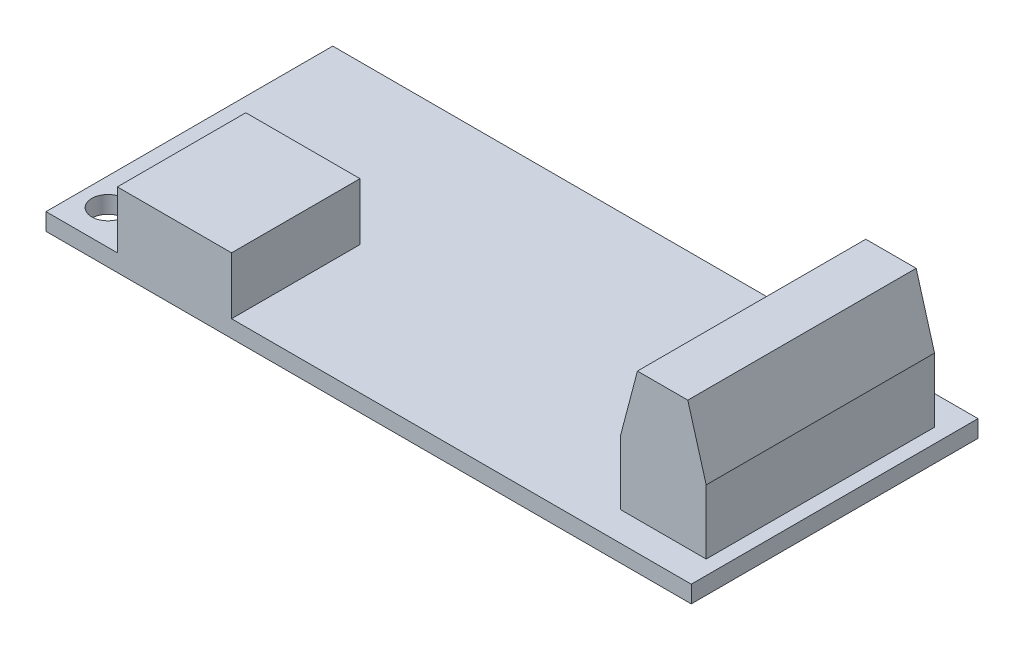
ISO-10303-21;
HEADER;
FILE_DESCRIPTION(('STEP AP214'),'2;1');
FILE_NAME('part.step','',(''),(''),'','','');
FILE_SCHEMA(('AUTOMOTIVE_DESIGN { 1 0 10303 214 1 1 1 1 }'));
ENDSEC;
DATA;
#1=APPLICATION_CONTEXT('core data for automotive mechanical design processes');
#2=APPLICATION_PROTOCOL_DEFINITION('international standard','automotive_design',2000,#1);
#3=PRODUCT_CONTEXT('',#1,'mechanical');
#4=PRODUCT('Part','Part','',(#3));
#5=PRODUCT_RELATED_PRODUCT_CATEGORY('part','',(#4));
#6=PRODUCT_DEFINITION_FORMATION('','',#4);
#7=PRODUCT_DEFINITION_CONTEXT('part definition',#1,'design');
#8=PRODUCT_DEFINITION('design','',#6,#7);
#9=PRODUCT_DEFINITION_SHAPE('','',#8);
#10=(LENGTH_UNIT() NAMED_UNIT(*) SI_UNIT(.MILLI.,.METRE.));
#11=(NAMED_UNIT(*) PLANE_ANGLE_UNIT() SI_UNIT($,.RADIAN.));
#12=(NAMED_UNIT(*) SI_UNIT($,.STERADIAN.) SOLID_ANGLE_UNIT());
#13=UNCERTAINTY_MEASURE_WITH_UNIT(LENGTH_MEASURE(1.E-05),#10,'distance_accuracy_value','');
#14=(GEOMETRIC_REPRESENTATION_CONTEXT(3) GLOBAL_UNCERTAINTY_ASSIGNED_CONTEXT((#13)) GLOBAL_UNIT_ASSIGNED_CONTEXT((#10,
#11,#12)) REPRESENTATION_CONTEXT('',''));
#15=CARTESIAN_POINT('',(0.,0.,0.));
#16=DIRECTION('',(0.,0.,1.));
#17=DIRECTION('',(1.,0.,0.));
#18=AXIS2_PLACEMENT_3D('',#15,#16,#17);
#19=CARTESIAN_POINT('',(0.,1.2,0.));
#20=DIRECTION('',(0.,1.,0.));
#21=DIRECTION('',(0.,0.,1.));
#22=AXIS2_PLACEMENT_3D('',#19,#20,#21);
#23=PLANE('',#22);
#24=CARTESIAN_POINT('',(11.835,1.2,-7.785));
#25=DIRECTION('',(0.,1.,0.));
#26=DIRECTION('',(0.,0.,1.));
#27=AXIS2_PLACEMENT_3D('',#24,#25,#26);
#28=CIRCLE('',#27,1.13);
#29=CARTESIAN_POINT('',(11.835,1.2,-6.655));
#30=VERTEX_POINT('',#29);
#31=EDGE_CURVE('E211',#30,#30,#28,.T.);
#32=ORIENTED_EDGE('',*,*,#31,.F.);
#33=EDGE_LOOP('',(#32));
#34=FACE_BOUND('',#33,.T.);
#35=CARTESIAN_POINT('',(-20.675,1.2,7.635));
#36=DIRECTION('',(0.,1.,0.));
#37=DIRECTION('',(0.,0.,1.));
#38=AXIS2_PLACEMENT_3D('',#35,#36,#37);
#39=CIRCLE('',#38,1.13);
#40=CARTESIAN_POINT('',(-20.675,1.2,8.765));
#41=VERTEX_POINT('',#40);
#42=EDGE_CURVE('E205',#41,#41,#39,.T.);
#43=ORIENTED_EDGE('',*,*,#42,.F.);
#44=EDGE_LOOP('',(#43));
#45=FACE_BOUND('',#44,.T.);
#46=DIRECTION('',(1.,0.,0.));
#47=VECTOR('',#46,1.);
#48=CARTESIAN_POINT('',(15.605,1.2,8.));
#49=LINE('',#48,#47);
#50=CARTESIAN_POINT('',(15.605,1.2,8.));
#51=VERTEX_POINT('',#50);
#52=CARTESIAN_POINT('',(21.605,1.2,8.));
#53=VERTEX_POINT('',#52);
#54=EDGE_CURVE('E189',#51,#53,#49,.T.);
#55=ORIENTED_EDGE('',*,*,#54,.F.);
#56=DIRECTION('',(0.,0.,1.));
#57=VECTOR('',#56,1.);
#58=CARTESIAN_POINT('',(15.605,1.2,-8.));
#59=LINE('',#58,#57);
#60=CARTESIAN_POINT('',(15.605,1.2,-8.));
#61=VERTEX_POINT('',#60);
#62=EDGE_CURVE('E179',#61,#51,#59,.T.);
#63=ORIENTED_EDGE('',*,*,#62,.F.);
#64=DIRECTION('',(-1.,0.,0.));
#65=VECTOR('',#64,1.);
#66=CARTESIAN_POINT('',(15.605,1.2,-8.));
#67=LINE('',#66,#65);
#68=CARTESIAN_POINT('',(21.605,1.2,-8.));
#69=VERTEX_POINT('',#68);
#70=EDGE_CURVE('E184',#69,#61,#67,.T.);
#71=ORIENTED_EDGE('',*,*,#70,.F.);
#72=DIRECTION('',(0.,0.,-1.));
#73=VECTOR('',#72,1.);
#74=CARTESIAN_POINT('',(21.605,1.2,-8.));
#75=LINE('',#74,#73);
#76=EDGE_CURVE('E192',#53,#69,#75,.T.);
#77=ORIENTED_EDGE('',*,*,#76,.F.);
#78=EDGE_LOOP('',(#55,#63,#71,#77));
#79=FACE_BOUND('',#78,.T.);
#80=DIRECTION('',(1.,0.,0.));
#81=VECTOR('',#80,1.);
#82=CARTESIAN_POINT('',(-22.605,1.2,10.045));
#83=LINE('',#82,#81);
#84=CARTESIAN_POINT('',(-22.605,1.2,10.045));
#85=VERTEX_POINT('',#84);
#86=CARTESIAN_POINT('',(-17.605,1.2,10.045));
#87=VERTEX_POINT('',#86);
#88=EDGE_CURVE('E222',#85,#87,#83,.T.);
#89=ORIENTED_EDGE('',*,*,#88,.T.);
#90=DIRECTION('',(0.,0.,1.));
#91=VECTOR('',#90,1.);
#92=CARTESIAN_POINT('',(-17.605,1.2,1.045));
#93=LINE('',#92,#91);
#94=CARTESIAN_POINT('',(-17.605,1.2,1.045));
#95=VERTEX_POINT('',#94);
#96=EDGE_CURVE('E55',#95,#87,#93,.T.);
#97=ORIENTED_EDGE('',*,*,#96,.F.);
#98=DIRECTION('',(-1.,0.,0.));
#99=VECTOR('',#98,1.);
#100=CARTESIAN_POINT('',(-17.605,1.2,1.045));
#101=LINE('',#100,#99);
#102=CARTESIAN_POINT('',(-9.60500000000001,1.2,1.045));
#103=VERTEX_POINT('',#102);
#104=EDGE_CURVE('E50',#103,#95,#101,.T.);
#105=ORIENTED_EDGE('',*,*,#104,.F.);
#106=DIRECTION('',(0.,0.,-1.));
#107=VECTOR('',#106,1.);
#108=CARTESIAN_POINT('',(-9.60500000000001,1.2,1.045));
#109=LINE('',#108,#107);
#110=CARTESIAN_POINT('',(-9.60500000000001,1.2,10.045));
#111=VERTEX_POINT('',#110);
#112=EDGE_CURVE('E259',#111,#103,#109,.T.);
#113=ORIENTED_EDGE('',*,*,#112,.F.);
#114=CARTESIAN_POINT('',(22.605,1.2,10.045));
#115=VERTEX_POINT('',#114);
#116=EDGE_CURVE('E220',#111,#115,#83,.T.);
#117=ORIENTED_EDGE('',*,*,#116,.T.);
#118=DIRECTION('',(0.,0.,-1.));
#119=VECTOR('',#118,1.);
#120=CARTESIAN_POINT('',(22.605,1.2,-10.045));
#121=LINE('',#120,#119);
#122=CARTESIAN_POINT('',(22.605,1.2,-10.045));
#123=VERTEX_POINT('',#122);
#124=EDGE_CURVE('E224',#115,#123,#121,.T.);
#125=ORIENTED_EDGE('',*,*,#124,.T.);
#126=DIRECTION('',(-1.,0.,0.));
#127=VECTOR('',#126,1.);
#128=CARTESIAN_POINT('',(-22.605,1.2,-10.045));
#129=LINE('',#128,#127);
#130=CARTESIAN_POINT('',(-22.605,1.2,-10.045));
#131=VERTEX_POINT('',#130);
#132=EDGE_CURVE('E226',#123,#131,#129,.T.);
#133=ORIENTED_EDGE('',*,*,#132,.T.);
#134=DIRECTION('',(0.,0.,1.));
#135=VECTOR('',#134,1.);
#136=CARTESIAN_POINT('',(-22.605,1.2,-10.045));
#137=LINE('',#136,#135);
#138=EDGE_CURVE('E217',#131,#85,#137,.T.);
#139=ORIENTED_EDGE('',*,*,#138,.T.);
#140=EDGE_LOOP('',(#89,#97,#105,#113,#117,#125,#133,#139));
#141=FACE_BOUND('',#140,.T.);
#142=ADVANCED_FACE('F35',(#34,#45,#79,#141),#23,.T.);
#143=CARTESIAN_POINT('',(0.,0.,0.));
#144=DIRECTION('',(0.,1.,0.));
#145=DIRECTION('',(0.,0.,1.));
#146=AXIS2_PLACEMENT_3D('',#143,#144,#145);
#147=PLANE('',#146);
#148=DIRECTION('',(0.,0.,1.));
#149=VECTOR('',#148,1.);
#150=CARTESIAN_POINT('',(-22.605,0.,-10.045));
#151=LINE('',#150,#149);
#152=CARTESIAN_POINT('',(-22.605,0.,-10.045));
#153=VERTEX_POINT('',#152);
#154=CARTESIAN_POINT('',(-22.605,0.,10.045));
#155=VERTEX_POINT('',#154);
#156=EDGE_CURVE('E214',#153,#155,#151,.T.);
#157=ORIENTED_EDGE('',*,*,#156,.F.);
#158=DIRECTION('',(-1.,0.,0.));
#159=VECTOR('',#158,1.);
#160=CARTESIAN_POINT('',(-22.605,0.,-10.045));
#161=LINE('',#160,#159);
#162=CARTESIAN_POINT('',(22.605,0.,-10.045));
#163=VERTEX_POINT('',#162);
#164=EDGE_CURVE('E221',#163,#153,#161,.T.);
#165=ORIENTED_EDGE('',*,*,#164,.F.);
#166=DIRECTION('',(0.,0.,-1.));
#167=VECTOR('',#166,1.);
#168=CARTESIAN_POINT('',(22.605,0.,-10.045));
#169=LINE('',#168,#167);
#170=CARTESIAN_POINT('',(22.605,0.,10.045));
#171=VERTEX_POINT('',#170);
#172=EDGE_CURVE('E233',#171,#163,#169,.T.);
#173=ORIENTED_EDGE('',*,*,#172,.F.);
#174=DIRECTION('',(1.,0.,0.));
#175=VECTOR('',#174,1.);
#176=CARTESIAN_POINT('',(-22.605,0.,10.045));
#177=LINE('',#176,#175);
#178=EDGE_CURVE('E231',#155,#171,#177,.T.);
#179=ORIENTED_EDGE('',*,*,#178,.F.);
#180=EDGE_LOOP('',(#157,#165,#173,#179));
#181=FACE_BOUND('',#180,.T.);
#182=CARTESIAN_POINT('',(11.835,0.,-7.785));
#183=DIRECTION('',(0.,1.,0.));
#184=DIRECTION('',(0.,0.,1.));
#185=AXIS2_PLACEMENT_3D('',#182,#183,#184);
#186=CIRCLE('',#185,1.13);
#187=CARTESIAN_POINT('',(11.835,0.,-6.655));
#188=VERTEX_POINT('',#187);
#189=EDGE_CURVE('E208',#188,#188,#186,.T.);
#190=ORIENTED_EDGE('',*,*,#189,.T.);
#191=EDGE_LOOP('',(#190));
#192=FACE_BOUND('',#191,.T.);
#193=CARTESIAN_POINT('',(-20.675,0.,7.635));
#194=DIRECTION('',(0.,1.,0.));
#195=DIRECTION('',(0.,0.,1.));
#196=AXIS2_PLACEMENT_3D('',#193,#194,#195);
#197=CIRCLE('',#196,1.13);
#198=CARTESIAN_POINT('',(-20.675,0.,8.765));
#199=VERTEX_POINT('',#198);
#200=EDGE_CURVE('E204',#199,#199,#197,.T.);
#201=ORIENTED_EDGE('',*,*,#200,.T.);
#202=EDGE_LOOP('',(#201));
#203=FACE_BOUND('',#202,.T.);
#204=ADVANCED_FACE('F250',(#181,#192,#203),#147,.F.);
#205=CARTESIAN_POINT('',(-22.605,1.2,-10.045));
#206=DIRECTION('',(1.,0.,0.));
#207=DIRECTION('',(0.,0.,-1.));
#208=AXIS2_PLACEMENT_3D('',#205,#206,#207);
#209=PLANE('',#208);
#210=ORIENTED_EDGE('',*,*,#156,.T.);
#211=DIRECTION('',(0.,-1.,0.));
#212=VECTOR('',#211,1.);
#213=CARTESIAN_POINT('',(-22.605,1.2,10.045));
#214=LINE('',#213,#212);
#215=EDGE_CURVE('E11',#85,#155,#214,.T.);
#216=ORIENTED_EDGE('',*,*,#215,.F.);
#217=ORIENTED_EDGE('',*,*,#138,.F.);
#218=DIRECTION('',(0.,-1.,0.));
#219=VECTOR('',#218,1.);
#220=CARTESIAN_POINT('',(-22.605,1.2,-10.045));
#221=LINE('',#220,#219);
#222=EDGE_CURVE('E228',#131,#153,#221,.T.);
#223=ORIENTED_EDGE('',*,*,#222,.T.);
#224=EDGE_LOOP('',(#210,#216,#217,#223));
#225=FACE_BOUND('',#224,.T.);
#226=ADVANCED_FACE('F37',(#225),#209,.F.);
#227=CARTESIAN_POINT('',(-22.605,1.2,10.045));
#228=DIRECTION('',(0.,0.,-1.));
#229=DIRECTION('',(-1.,0.,0.));
#230=AXIS2_PLACEMENT_3D('',#227,#228,#229);
#231=PLANE('',#230);
#232=ORIENTED_EDGE('',*,*,#178,.T.);
#233=DIRECTION('',(0.,-1.,0.));
#234=VECTOR('',#233,1.);
#235=CARTESIAN_POINT('',(22.605,1.2,10.045));
#236=LINE('',#235,#234);
#237=EDGE_CURVE('E43',#115,#171,#236,.T.);
#238=ORIENTED_EDGE('',*,*,#237,.F.);
#239=ORIENTED_EDGE('',*,*,#116,.F.);
#240=DIRECTION('',(0.,-1.,0.));
#241=VECTOR('',#240,1.);
#242=CARTESIAN_POINT('',(-9.60500000000001,5.2,10.045));
#243=LINE('',#242,#241);
#244=CARTESIAN_POINT('',(-9.60500000000001,5.2,10.045));
#245=VERTEX_POINT('',#244);
#246=EDGE_CURVE('E141',#245,#111,#243,.T.);
#247=ORIENTED_EDGE('',*,*,#246,.F.);
#248=DIRECTION('',(1.,0.,0.));
#249=VECTOR('',#248,1.);
#250=CARTESIAN_POINT('',(-17.605,5.2,10.045));
#251=LINE('',#250,#249);
#252=CARTESIAN_POINT('',(-17.605,5.2,10.045));
#253=VERTEX_POINT('',#252);
#254=EDGE_CURVE('E135',#253,#245,#251,.T.);
#255=ORIENTED_EDGE('',*,*,#254,.F.);
#256=DIRECTION('',(0.,-1.,0.));
#257=VECTOR('',#256,1.);
#258=CARTESIAN_POINT('',(-17.605,5.2,10.045));
#259=LINE('',#258,#257);
#260=EDGE_CURVE('E139',#253,#87,#259,.T.);
#261=ORIENTED_EDGE('',*,*,#260,.T.);
#262=ORIENTED_EDGE('',*,*,#88,.F.);
#263=ORIENTED_EDGE('',*,*,#215,.T.);
#264=EDGE_LOOP('',(#232,#238,#239,#247,#255,#261,#262,#263));
#265=FACE_BOUND('',#264,.T.);
#266=ADVANCED_FACE('F137',(#265),#231,.F.);
#267=CARTESIAN_POINT('',(22.605,1.2,-10.045));
#268=DIRECTION('',(-1.,0.,0.));
#269=DIRECTION('',(0.,0.,1.));
#270=AXIS2_PLACEMENT_3D('',#267,#268,#269);
#271=PLANE('',#270);
#272=ORIENTED_EDGE('',*,*,#172,.T.);
#273=DIRECTION('',(0.,-1.,0.));
#274=VECTOR('',#273,1.);
#275=CARTESIAN_POINT('',(22.605,1.2,-10.045));
#276=LINE('',#275,#274);
#277=EDGE_CURVE('E238',#123,#163,#276,.T.);
#278=ORIENTED_EDGE('',*,*,#277,.F.);
#279=ORIENTED_EDGE('',*,*,#124,.F.);
#280=ORIENTED_EDGE('',*,*,#237,.T.);
#281=EDGE_LOOP('',(#272,#278,#279,#280));
#282=FACE_BOUND('',#281,.T.);
#283=ADVANCED_FACE('F245',(#282),#271,.F.);
#284=CARTESIAN_POINT('',(-22.605,1.2,-10.045));
#285=DIRECTION('',(0.,0.,1.));
#286=DIRECTION('',(1.,0.,0.));
#287=AXIS2_PLACEMENT_3D('',#284,#285,#286);
#288=PLANE('',#287);
#289=ORIENTED_EDGE('',*,*,#164,.T.);
#290=ORIENTED_EDGE('',*,*,#222,.F.);
#291=ORIENTED_EDGE('',*,*,#132,.F.);
#292=ORIENTED_EDGE('',*,*,#277,.T.);
#293=EDGE_LOOP('',(#289,#290,#291,#292));
#294=FACE_BOUND('',#293,.T.);
#295=ADVANCED_FACE('F254',(#294),#288,.F.);
#296=CARTESIAN_POINT('',(11.835,1.2,-7.785));
#297=DIRECTION('',(0.,-1.,0.));
#298=DIRECTION('',(0.,0.,-1.));
#299=AXIS2_PLACEMENT_3D('',#296,#297,#298);
#300=CYLINDRICAL_SURFACE('',#299,1.13);
#301=ORIENTED_EDGE('',*,*,#31,.T.);
#302=EDGE_LOOP('',(#301));
#303=FACE_BOUND('',#302,.T.);
#304=ORIENTED_EDGE('',*,*,#189,.F.);
#305=EDGE_LOOP('',(#304));
#306=FACE_BOUND('',#305,.T.);
#307=ADVANCED_FACE('F291',(#303,#306),#300,.F.);
#308=CARTESIAN_POINT('',(-20.675,1.2,7.635));
#309=DIRECTION('',(0.,-1.,0.));
#310=DIRECTION('',(0.,0.,-1.));
#311=AXIS2_PLACEMENT_3D('',#308,#309,#310);
#312=CYLINDRICAL_SURFACE('',#311,1.13);
#313=ORIENTED_EDGE('',*,*,#42,.T.);
#314=EDGE_LOOP('',(#313));
#315=FACE_BOUND('',#314,.T.);
#316=ORIENTED_EDGE('',*,*,#200,.F.);
#317=EDGE_LOOP('',(#316));
#318=FACE_BOUND('',#317,.T.);
#319=ADVANCED_FACE('F337',(#315,#318),#312,.F.);
#320=CARTESIAN_POINT('',(15.605,10.2,-8.));
#321=DIRECTION('',(1.,0.,0.));
#322=DIRECTION('',(0.,0.,-1.));
#323=AXIS2_PLACEMENT_3D('',#320,#321,#322);
#324=PLANE('',#323);
#325=DIRECTION('',(0.,-1.,0.));
#326=VECTOR('',#325,1.);
#327=CARTESIAN_POINT('',(15.605,10.2,8.));
#328=LINE('',#327,#326);
#329=CARTESIAN_POINT('',(15.605,5.7,8.));
#330=VERTEX_POINT('',#329);
#331=EDGE_CURVE('E202',#330,#51,#328,.T.);
#332=ORIENTED_EDGE('',*,*,#331,.F.);
#333=DIRECTION('',(0.,0.,1.));
#334=VECTOR('',#333,1.);
#335=CARTESIAN_POINT('',(15.605,5.7,-10.046));
#336=LINE('',#335,#334);
#337=CARTESIAN_POINT('',(15.605,5.7,-8.));
#338=VERTEX_POINT('',#337);
#339=EDGE_CURVE('E172',#338,#330,#336,.T.);
#340=ORIENTED_EDGE('',*,*,#339,.F.);
#341=DIRECTION('',(0.,-1.,0.));
#342=VECTOR('',#341,1.);
#343=CARTESIAN_POINT('',(15.605,10.2,-8.));
#344=LINE('',#343,#342);
#345=EDGE_CURVE('E186',#338,#61,#344,.T.);
#346=ORIENTED_EDGE('',*,*,#345,.T.);
#347=ORIENTED_EDGE('',*,*,#62,.T.);
#348=EDGE_LOOP('',(#332,#340,#346,#347));
#349=FACE_BOUND('',#348,.T.);
#350=ADVANCED_FACE('F345',(#349),#324,.F.);
#351=CARTESIAN_POINT('',(15.605,10.2,8.));
#352=DIRECTION('',(0.,0.,-1.));
#353=DIRECTION('',(-1.,0.,0.));
#354=AXIS2_PLACEMENT_3D('',#351,#352,#353);
#355=PLANE('',#354);
#356=DIRECTION('',(0.,-1.,0.));
#357=VECTOR('',#356,1.);
#358=CARTESIAN_POINT('',(21.605,10.2,8.));
#359=LINE('',#358,#357);
#360=CARTESIAN_POINT('',(21.605,5.7,8.));
#361=VERTEX_POINT('',#360);
#362=EDGE_CURVE('E200',#361,#53,#359,.T.);
#363=ORIENTED_EDGE('',*,*,#362,.F.);
#364=DIRECTION('',(0.275099697333907,-0.96141570432711,0.));
#365=VECTOR('',#364,1.);
#366=CARTESIAN_POINT('',(20.3173690278504,10.2,8.));
#367=LINE('',#366,#365);
#368=CARTESIAN_POINT('',(20.3173690278504,10.2,8.));
#369=VERTEX_POINT('',#368);
#370=EDGE_CURVE('E158',#369,#361,#367,.T.);
#371=ORIENTED_EDGE('',*,*,#370,.F.);
#372=DIRECTION('',(1.,0.,0.));
#373=VECTOR('',#372,1.);
#374=CARTESIAN_POINT('',(15.605,10.2,8.));
#375=LINE('',#374,#373);
#376=CARTESIAN_POINT('',(16.788227764863,10.2,8.));
#377=VERTEX_POINT('',#376);
#378=EDGE_CURVE('E180',#377,#369,#375,.T.);
#379=ORIENTED_EDGE('',*,*,#378,.F.);
#380=DIRECTION('',(0.254295761370684,0.967126499352026,0.));
#381=VECTOR('',#380,1.);
#382=CARTESIAN_POINT('',(15.605,5.7,8.));
#383=LINE('',#382,#381);
#384=EDGE_CURVE('E169',#330,#377,#383,.T.);
#385=ORIENTED_EDGE('',*,*,#384,.F.);
#386=ORIENTED_EDGE('',*,*,#331,.T.);
#387=ORIENTED_EDGE('',*,*,#54,.T.);
#388=EDGE_LOOP('',(#363,#371,#379,#385,#386,#387));
#389=FACE_BOUND('',#388,.T.);
#390=ADVANCED_FACE('F353',(#389),#355,.F.);
#391=CARTESIAN_POINT('',(21.605,10.2,-8.));
#392=DIRECTION('',(-1.,0.,0.));
#393=DIRECTION('',(0.,0.,1.));
#394=AXIS2_PLACEMENT_3D('',#391,#392,#393);
#395=PLANE('',#394);
#396=DIRECTION('',(0.,-1.,0.));
#397=VECTOR('',#396,1.);
#398=CARTESIAN_POINT('',(21.605,10.2,-8.));
#399=LINE('',#398,#397);
#400=CARTESIAN_POINT('',(21.605,5.7,-8.));
#401=VERTEX_POINT('',#400);
#402=EDGE_CURVE('E198',#401,#69,#399,.T.);
#403=ORIENTED_EDGE('',*,*,#402,.F.);
#404=DIRECTION('',(0.,0.,1.));
#405=VECTOR('',#404,1.);
#406=CARTESIAN_POINT('',(21.605,5.7,-10.046));
#407=LINE('',#406,#405);
#408=EDGE_CURVE('E166',#401,#361,#407,.T.);
#409=ORIENTED_EDGE('',*,*,#408,.T.);
#410=ORIENTED_EDGE('',*,*,#362,.T.);
#411=ORIENTED_EDGE('',*,*,#76,.T.);
#412=EDGE_LOOP('',(#403,#409,#410,#411));
#413=FACE_BOUND('',#412,.T.);
#414=ADVANCED_FACE('F362',(#413),#395,.F.);
#415=CARTESIAN_POINT('',(15.605,10.2,-8.));
#416=DIRECTION('',(0.,0.,1.));
#417=DIRECTION('',(1.,0.,0.));
#418=AXIS2_PLACEMENT_3D('',#415,#416,#417);
#419=PLANE('',#418);
#420=DIRECTION('',(-1.,0.,0.));
#421=VECTOR('',#420,1.);
#422=CARTESIAN_POINT('',(15.605,10.2,-8.));
#423=LINE('',#422,#421);
#424=CARTESIAN_POINT('',(20.3173690278504,10.2,-8.));
#425=VERTEX_POINT('',#424);
#426=CARTESIAN_POINT('',(16.788227764863,10.2,-8.));
#427=VERTEX_POINT('',#426);
#428=EDGE_CURVE('E183',#425,#427,#423,.T.);
#429=ORIENTED_EDGE('',*,*,#428,.F.);
#430=DIRECTION('',(-0.275099697333908,0.96141570432711,0.));
#431=VECTOR('',#430,1.);
#432=CARTESIAN_POINT('',(20.3173690278504,10.2,-8.));
#433=LINE('',#432,#431);
#434=EDGE_CURVE('E156',#401,#425,#433,.T.);
#435=ORIENTED_EDGE('',*,*,#434,.F.);
#436=ORIENTED_EDGE('',*,*,#402,.T.);
#437=ORIENTED_EDGE('',*,*,#70,.T.);
#438=ORIENTED_EDGE('',*,*,#345,.F.);
#439=DIRECTION('',(-0.254295761370684,-0.967126499352026,0.));
#440=VECTOR('',#439,1.);
#441=CARTESIAN_POINT('',(15.605,5.7,-8.));
#442=LINE('',#441,#440);
#443=EDGE_CURVE('E176',#427,#338,#442,.T.);
#444=ORIENTED_EDGE('',*,*,#443,.F.);
#445=EDGE_LOOP('',(#429,#435,#436,#437,#438,#444));
#446=FACE_BOUND('',#445,.T.);
#447=ADVANCED_FACE('F371',(#446),#419,.F.);
#448=CARTESIAN_POINT('',(0.,10.2,0.));
#449=DIRECTION('',(0.,1.,0.));
#450=DIRECTION('',(0.,0.,1.));
#451=AXIS2_PLACEMENT_3D('',#448,#449,#450);
#452=PLANE('',#451);
#453=DIRECTION('',(0.,0.,1.));
#454=VECTOR('',#453,1.);
#455=CARTESIAN_POINT('',(20.3173690278504,10.2,-10.046));
#456=LINE('',#455,#454);
#457=EDGE_CURVE('E165',#425,#369,#456,.T.);
#458=ORIENTED_EDGE('',*,*,#457,.F.);
#459=ORIENTED_EDGE('',*,*,#428,.T.);
#460=DIRECTION('',(0.,0.,1.));
#461=VECTOR('',#460,1.);
#462=CARTESIAN_POINT('',(16.788227764863,10.2,-10.046));
#463=LINE('',#462,#461);
#464=EDGE_CURVE('E173',#427,#377,#463,.T.);
#465=ORIENTED_EDGE('',*,*,#464,.T.);
#466=ORIENTED_EDGE('',*,*,#378,.T.);
#467=EDGE_LOOP('',(#458,#459,#465,#466));
#468=FACE_BOUND('',#467,.T.);
#469=ADVANCED_FACE('F380',(#468),#452,.T.);
#470=CARTESIAN_POINT('',(15.605,5.7,-10.046));
#471=DIRECTION('',(0.967126499352026,-0.254295761370684,0.));
#472=DIRECTION('',(0.254295761370684,0.967126499352026,0.));
#473=AXIS2_PLACEMENT_3D('',#470,#471,#472);
#474=PLANE('',#473);
#475=ORIENTED_EDGE('',*,*,#443,.T.);
#476=ORIENTED_EDGE('',*,*,#339,.T.);
#477=ORIENTED_EDGE('',*,*,#384,.T.);
#478=ORIENTED_EDGE('',*,*,#464,.F.);
#479=EDGE_LOOP('',(#475,#476,#477,#478));
#480=FACE_BOUND('',#479,.T.);
#481=ADVANCED_FACE('F389',(#480),#474,.F.);
#482=CARTESIAN_POINT('',(20.3173690278504,10.2,-10.046));
#483=DIRECTION('',(-0.96141570432711,-0.275099697333908,0.));
#484=DIRECTION('',(0.275099697333908,-0.96141570432711,0.));
#485=AXIS2_PLACEMENT_3D('',#482,#483,#484);
#486=PLANE('',#485);
#487=ORIENTED_EDGE('',*,*,#434,.T.);
#488=ORIENTED_EDGE('',*,*,#457,.T.);
#489=ORIENTED_EDGE('',*,*,#370,.T.);
#490=ORIENTED_EDGE('',*,*,#408,.F.);
#491=EDGE_LOOP('',(#487,#488,#489,#490));
#492=FACE_BOUND('',#491,.T.);
#493=ADVANCED_FACE('F398',(#492),#486,.F.);
#494=CARTESIAN_POINT('',(-17.605,5.2,1.045));
#495=DIRECTION('',(1.,0.,0.));
#496=DIRECTION('',(0.,0.,-1.));
#497=AXIS2_PLACEMENT_3D('',#494,#495,#496);
#498=PLANE('',#497);
#499=ORIENTED_EDGE('',*,*,#96,.T.);
#500=ORIENTED_EDGE('',*,*,#260,.F.);
#501=DIRECTION('',(0.,0.,1.));
#502=VECTOR('',#501,1.);
#503=CARTESIAN_POINT('',(-17.605,5.2,1.045));
#504=LINE('',#503,#502);
#505=CARTESIAN_POINT('',(-17.605,5.2,1.045));
#506=VERTEX_POINT('',#505);
#507=EDGE_CURVE('E145',#506,#253,#504,.T.);
#508=ORIENTED_EDGE('',*,*,#507,.F.);
#509=DIRECTION('',(0.,-1.,0.));
#510=VECTOR('',#509,1.);
#511=CARTESIAN_POINT('',(-17.605,5.2,1.045));
#512=LINE('',#511,#510);
#513=EDGE_CURVE('E266',#506,#95,#512,.T.);
#514=ORIENTED_EDGE('',*,*,#513,.T.);
#515=EDGE_LOOP('',(#499,#500,#508,#514));
#516=FACE_BOUND('',#515,.T.);
#517=ADVANCED_FACE('F155',(#516),#498,.F.);
#518=CARTESIAN_POINT('',(-9.60500000000001,5.2,1.045));
#519=DIRECTION('',(-1.,0.,0.));
#520=DIRECTION('',(0.,0.,1.));
#521=AXIS2_PLACEMENT_3D('',#518,#519,#520);
#522=PLANE('',#521);
#523=ORIENTED_EDGE('',*,*,#112,.T.);
#524=DIRECTION('',(0.,-1.,0.));
#525=VECTOR('',#524,1.);
#526=CARTESIAN_POINT('',(-9.60500000000001,5.2,1.045));
#527=LINE('',#526,#525);
#528=CARTESIAN_POINT('',(-9.60500000000001,5.2,1.045));
#529=VERTEX_POINT('',#528);
#530=EDGE_CURVE('E160',#529,#103,#527,.T.);
#531=ORIENTED_EDGE('',*,*,#530,.F.);
#532=DIRECTION('',(0.,0.,-1.));
#533=VECTOR('',#532,1.);
#534=CARTESIAN_POINT('',(-9.60500000000001,5.2,1.045));
#535=LINE('',#534,#533);
#536=EDGE_CURVE('E144',#245,#529,#535,.T.);
#537=ORIENTED_EDGE('',*,*,#536,.F.);
#538=ORIENTED_EDGE('',*,*,#246,.T.);
#539=EDGE_LOOP('',(#523,#531,#537,#538));
#540=FACE_BOUND('',#539,.T.);
#541=ADVANCED_FACE('F264',(#540),#522,.F.);
#542=CARTESIAN_POINT('',(-17.605,5.2,1.045));
#543=DIRECTION('',(0.,0.,1.));
#544=DIRECTION('',(1.,0.,0.));
#545=AXIS2_PLACEMENT_3D('',#542,#543,#544);
#546=PLANE('',#545);
#547=ORIENTED_EDGE('',*,*,#104,.T.);
#548=ORIENTED_EDGE('',*,*,#513,.F.);
#549=DIRECTION('',(-1.,0.,0.));
#550=VECTOR('',#549,1.);
#551=CARTESIAN_POINT('',(-17.605,5.2,1.045));
#552=LINE('',#551,#550);
#553=EDGE_CURVE('E150',#529,#506,#552,.T.);
#554=ORIENTED_EDGE('',*,*,#553,.F.);
#555=ORIENTED_EDGE('',*,*,#530,.T.);
#556=EDGE_LOOP('',(#547,#548,#554,#555));
#557=FACE_BOUND('',#556,.T.);
#558=ADVANCED_FACE('F272',(#557),#546,.F.);
#559=CARTESIAN_POINT('',(0.,5.2,0.));
#560=DIRECTION('',(0.,1.,0.));
#561=DIRECTION('',(0.,0.,1.));
#562=AXIS2_PLACEMENT_3D('',#559,#560,#561);
#563=PLANE('',#562);
#564=ORIENTED_EDGE('',*,*,#507,.T.);
#565=ORIENTED_EDGE('',*,*,#254,.T.);
#566=ORIENTED_EDGE('',*,*,#536,.T.);
#567=ORIENTED_EDGE('',*,*,#553,.T.);
#568=EDGE_LOOP('',(#564,#565,#566,#567));
#569=FACE_BOUND('',#568,.T.);
#570=ADVANCED_FACE('F148',(#569),#563,.T.);
#571=CLOSED_SHELL('',(#142,#204,#226,#266,#283,#295,#307,#319,#350,#390,#414,#447,#469,#481,
#493,#517,#541,#558,#570));
#572=MANIFOLD_SOLID_BREP('B2',#571);
#573=ADVANCED_BREP_SHAPE_REPRESENTATION('',(#18,#572),#14);
#574=SHAPE_DEFINITION_REPRESENTATION(#9,#573);
ENDSEC;
END-ISO-10303-21;
